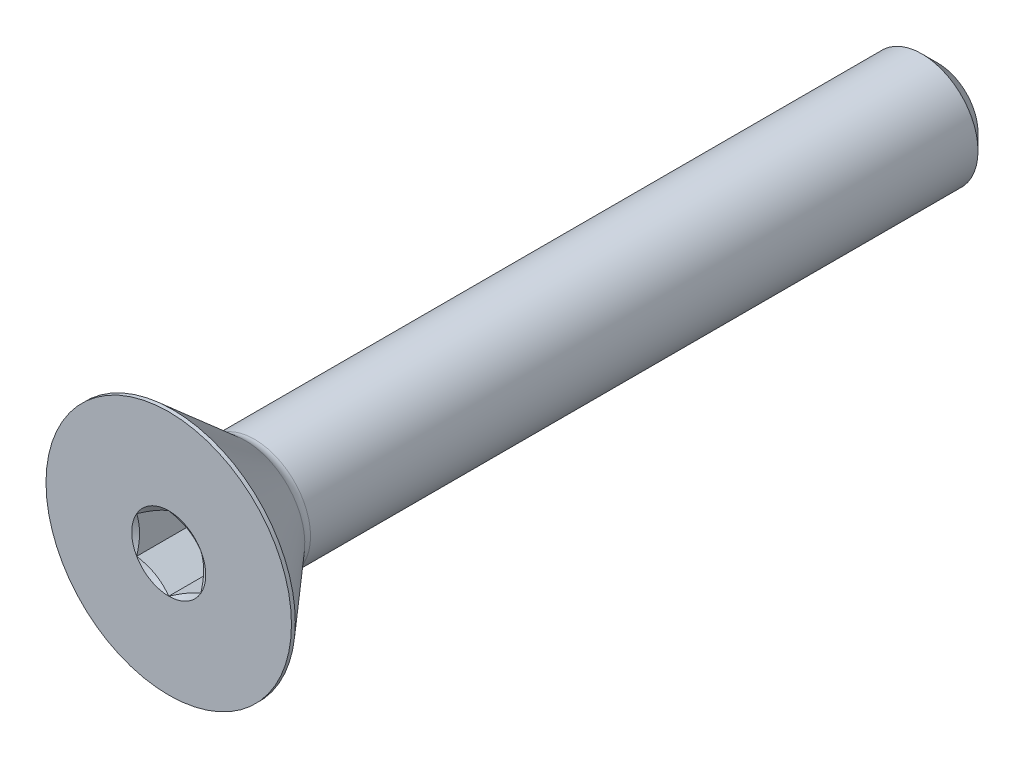
ISO-10303-21;
HEADER;
FILE_DESCRIPTION(('STEP AP214'),'2;1');
FILE_NAME('part.step','',(''),(''),'','','');
FILE_SCHEMA(('AUTOMOTIVE_DESIGN { 1 0 10303 214 1 1 1 1 }'));
ENDSEC;
DATA;
#1=APPLICATION_CONTEXT('core data for automotive mechanical design processes');
#2=APPLICATION_PROTOCOL_DEFINITION('international standard','automotive_design',2000,#1);
#3=PRODUCT_CONTEXT('',#1,'mechanical');
#4=PRODUCT('Part','Part','',(#3));
#5=PRODUCT_RELATED_PRODUCT_CATEGORY('part','',(#4));
#6=PRODUCT_DEFINITION_FORMATION('','',#4);
#7=PRODUCT_DEFINITION_CONTEXT('part definition',#1,'design');
#8=PRODUCT_DEFINITION('design','',#6,#7);
#9=PRODUCT_DEFINITION_SHAPE('','',#8);
#10=(LENGTH_UNIT() NAMED_UNIT(*) SI_UNIT(.MILLI.,.METRE.));
#11=(NAMED_UNIT(*) PLANE_ANGLE_UNIT() SI_UNIT($,.RADIAN.));
#12=(NAMED_UNIT(*) SI_UNIT($,.STERADIAN.) SOLID_ANGLE_UNIT());
#13=UNCERTAINTY_MEASURE_WITH_UNIT(LENGTH_MEASURE(1.E-05),#10,'distance_accuracy_value','');
#14=(GEOMETRIC_REPRESENTATION_CONTEXT(3) GLOBAL_UNCERTAINTY_ASSIGNED_CONTEXT((#13)) GLOBAL_UNIT_ASSIGNED_CONTEXT((#10,
#11,#12)) REPRESENTATION_CONTEXT('',''));
#15=CARTESIAN_POINT('',(0.,0.,0.));
#16=DIRECTION('',(0.,0.,1.));
#17=DIRECTION('',(1.,0.,0.));
#18=AXIS2_PLACEMENT_3D('',#15,#16,#17);
#19=CARTESIAN_POINT('',(-1.190625,0.687407664253899,-1.99136));
#20=DIRECTION('',(-1.,0.,0.));
#21=DIRECTION('',(0.,-1.,0.));
#22=AXIS2_PLACEMENT_3D('',#19,#20,#21);
#23=PLANE('',#22);
#24=CARTESIAN_POINT('',(-1.190625,-0.687407664256463,-5.03401109731775E-12));
#25=CARTESIAN_POINT('',(-1.190625,-0.626992856751789,-0.0174453082922929));
#26=CARTESIAN_POINT('',(-1.190625,-0.566056549488464,-0.0333109031601274));
#27=CARTESIAN_POINT('',(-1.190625,-0.443128863563517,-0.0610038224899523));
#28=CARTESIAN_POINT('',(-1.190625,-0.381135301425816,-0.0728213513161339));
#29=CARTESIAN_POINT('',(-1.190625,-0.257916432288905,-0.091216186921769));
#30=CARTESIAN_POINT('',(-1.190625,-0.196710078781245,-0.0979159358017033));
#31=CARTESIAN_POINT('',(-1.190625,-0.0740095259036076,-0.105912542076732));
#32=CARTESIAN_POINT('',(-1.190625,-0.0125157722107632,-0.107216022941889));
#33=CARTESIAN_POINT('',(-1.190625,0.102378709677028,-0.10449741162382));
#34=CARTESIAN_POINT('',(-1.190625,0.155796678724978,-0.101142828627492));
#35=CARTESIAN_POINT('',(-1.190625,0.262284616177316,-0.0905129194020046));
#36=CARTESIAN_POINT('',(-1.190625,0.315354216543268,-0.0832339655705969));
#37=CARTESIAN_POINT('',(-1.190625,0.422061529189285,-0.0650379898324941));
#38=CARTESIAN_POINT('',(-1.190625,0.475685743031827,-0.0540438723610452));
#39=CARTESIAN_POINT('',(-1.190625,0.582134596890679,-0.0290918736246562));
#40=CARTESIAN_POINT('',(-1.190625,0.634960599587853,-0.0151398513230711));
#41=CARTESIAN_POINT('',(-1.190625,0.687407664256464,-5.03342759882053E-12));
#42=B_SPLINE_CURVE_WITH_KNOTS('',3,(#24,#25,#26,#27,#28,#29,#30,#31,#32,#33,#34,#35,#36,#37,#38,
#39,#40,#41),.UNSPECIFIED.,.F.,.F.,(4,2,2,2,2,2,2,2,4),(0.,0.188723594372522,0.377900694183834,
0.56239624676756,0.746665279146542,0.907082289328546,1.0676478403546,1.2317739658786,
1.39557798110354),.UNSPECIFIED.);
#43=CARTESIAN_POINT('',(-1.19062500000111,-0.687407664263259,-2.51690109504208E-12));
#44=VERTEX_POINT('',#43);
#45=CARTESIAN_POINT('',(-1.19062500000866,0.687407664250182,-2.5166847221934E-12));
#46=VERTEX_POINT('',#45);
#47=EDGE_CURVE('E29',#44,#46,#42,.T.);
#48=ORIENTED_EDGE('',*,*,#47,.F.);
#49=DIRECTION('',(0.,0.,1.));
#50=VECTOR('',#49,1.);
#51=CARTESIAN_POINT('',(-1.190625,-0.687407664253899,-1.99136));
#52=LINE('',#51,#50);
#53=CARTESIAN_POINT('',(-1.190625,-0.687407664253899,-1.99136));
#54=VERTEX_POINT('',#53);
#55=EDGE_CURVE('E131',#44,#54,#52,.F.);
#56=ORIENTED_EDGE('',*,*,#55,.T.);
#57=DIRECTION('',(0.,-1.,0.));
#58=VECTOR('',#57,1.);
#59=CARTESIAN_POINT('',(-1.190625,0.687407664253899,-1.99136));
#60=LINE('',#59,#58);
#61=CARTESIAN_POINT('',(-1.190625,0.6874076642539,-1.99136));
#62=VERTEX_POINT('',#61);
#63=EDGE_CURVE('E97',#62,#54,#60,.T.);
#64=ORIENTED_EDGE('',*,*,#63,.F.);
#65=DIRECTION('',(0.,0.,1.));
#66=VECTOR('',#65,1.);
#67=CARTESIAN_POINT('',(-1.190625,0.687407664253899,-1.99136));
#68=LINE('',#67,#66);
#69=EDGE_CURVE('E96',#62,#46,#68,.T.);
#70=ORIENTED_EDGE('',*,*,#69,.T.);
#71=EDGE_LOOP('',(#48,#56,#64,#70));
#72=FACE_BOUND('',#71,.T.);
#73=ADVANCED_FACE('F25',(#72),#23,.F.);
#74=CARTESIAN_POINT('',(0.,1.3748153285078,-1.99136));
#75=DIRECTION('',(-0.5,0.866025403784439,0.));
#76=DIRECTION('',(-0.866025403784439,-0.5,0.));
#77=AXIS2_PLACEMENT_3D('',#74,#75,#76);
#78=PLANE('',#77);
#79=CARTESIAN_POINT('',(-1.19062500000222,0.687407664252618,-5.03379331456237E-12));
#80=CARTESIAN_POINT('',(-1.13830424193826,0.717615068005051,-0.017445308292975));
#81=CARTESIAN_POINT('',(-1.08553185183521,0.748083221636828,-0.0333109031614361));
#82=CARTESIAN_POINT('',(-0.979073352995295,0.809547064599574,-0.0610038224923478));
#83=CARTESIAN_POINT('',(-0.925385353312685,0.840543845668582,-0.0728213513189882));
#84=CARTESIAN_POINT('',(-0.818674682414037,0.902153280237322,-0.0912161869252817));
#85=CARTESIAN_POINT('',(-0.765668425403175,0.932756456991278,-0.0979159358054302));
#86=CARTESIAN_POINT('',(-0.659406629552295,0.994106733430356,-0.105912542080642));
#87=CARTESIAN_POINT('',(-0.606151476679997,1.02485361027691,-0.107216022945769));
#88=CARTESIAN_POINT('',(-0.506649936610504,1.08230085122082,-0.104497411627427));
#89=CARTESIAN_POINT('',(-0.460388618396622,1.10900983574467,-0.101142828630923));
#90=CARTESIAN_POINT('',(-0.368167359366739,1.16225380447058,-0.090512919404986));
#91=CARTESIAN_POINT('',(-0.322207737281372,1.18878860465342,-0.0832339655733058));
#92=CARTESIAN_POINT('',(-0.229796493760794,1.24214226097617,-0.0650379898345645));
#93=CARTESIAN_POINT('',(-0.18335656231539,1.26895436789732,-0.0540438723627428));
#94=CARTESIAN_POINT('',(-0.0911691506703446,1.32217879482648,-0.0290918736255461));
#95=CARTESIAN_POINT('',(-0.045420490354456,1.34859179617493,-0.0151398513235267));
#96=CARTESIAN_POINT('',(2.21941767620509E-12,1.37481532850908,-5.03397609308233E-12));
#97=B_SPLINE_CURVE_WITH_KNOTS('',3,(#79,#80,#81,#82,#83,#84,#85,#86,#87,#88,#89,#90,#91,#92,#93,
#94,#95,#96),.UNSPECIFIED.,.F.,.F.,(4,2,2,2,2,2,2,2,4),(0.,0.188723594373651,0.377900694186133,
0.562396246770661,0.746665279150423,0.907082289331712,1.06764784035706,1.23177396588058,
1.39557798110501),.UNSPECIFIED.);
#98=CARTESIAN_POINT('',(-7.55282814164622E-12,1.37481532851344,-2.51699768875043E-12));
#99=VERTEX_POINT('',#98);
#100=EDGE_CURVE('E105',#46,#99,#97,.T.);
#101=ORIENTED_EDGE('',*,*,#100,.F.);
#102=ORIENTED_EDGE('',*,*,#69,.F.);
#103=DIRECTION('',(-0.866025403784439,-0.5,0.));
#104=VECTOR('',#103,1.);
#105=CARTESIAN_POINT('',(0.,1.3748153285078,-1.99136));
#106=LINE('',#105,#104);
#107=CARTESIAN_POINT('',(0.,1.3748153285078,-1.99136));
#108=VERTEX_POINT('',#107);
#109=EDGE_CURVE('E291',#108,#62,#106,.T.);
#110=ORIENTED_EDGE('',*,*,#109,.F.);
#111=DIRECTION('',(0.,0.,1.));
#112=VECTOR('',#111,1.);
#113=CARTESIAN_POINT('',(0.,1.3748153285078,-1.99136));
#114=LINE('',#113,#112);
#115=EDGE_CURVE('E126',#108,#99,#114,.T.);
#116=ORIENTED_EDGE('',*,*,#115,.T.);
#117=EDGE_LOOP('',(#101,#102,#110,#116));
#118=FACE_BOUND('',#117,.T.);
#119=ADVANCED_FACE('F124',(#118),#78,.F.);
#120=CARTESIAN_POINT('',(-1.190625,-0.687407664253899,-1.99136));
#121=DIRECTION('',(-0.5,-0.866025403784439,0.));
#122=DIRECTION('',(0.866025403784439,-0.5,0.));
#123=AXIS2_PLACEMENT_3D('',#120,#121,#122);
#124=PLANE('',#123);
#125=CARTESIAN_POINT('',(2.22150647508113E-12,-1.37481532850908,-5.03404687750762E-12));
#126=CARTESIAN_POINT('',(-0.052320758061739,-1.34460792475665,-0.0174453082929752));
#127=CARTESIAN_POINT('',(-0.105093148164792,-1.31413977112487,-0.0333109031614363));
#128=CARTESIAN_POINT('',(-0.211551647004703,-1.25267592816212,-0.061003822492348));
#129=CARTESIAN_POINT('',(-0.265239646687313,-1.22167914709311,-0.0728213513189884));
#130=CARTESIAN_POINT('',(-0.371950317585961,-1.16006971252437,-0.0912161869252821));
#131=CARTESIAN_POINT('',(-0.424956574596824,-1.12946653577042,-0.0979159358054306));
#132=CARTESIAN_POINT('',(-0.531218370447703,-1.06811625933134,-0.105912542080642));
#133=CARTESIAN_POINT('',(-0.584473523320001,-1.03736938248478,-0.10721602294577));
#134=CARTESIAN_POINT('',(-0.683975063389495,-0.97992214154088,-0.104497411627427));
#135=CARTESIAN_POINT('',(-0.730236381603377,-0.953213157017029,-0.101142828630923));
#136=CARTESIAN_POINT('',(-0.822457640633261,-0.899969188291119,-0.0905129194049867));
#137=CARTESIAN_POINT('',(-0.868417262718628,-0.873434388108279,-0.0832339655733063));
#138=CARTESIAN_POINT('',(-0.960828506239207,-0.820080731785525,-0.0650379898345648));
#139=CARTESIAN_POINT('',(-1.00726843768461,-0.793268624864373,-0.054043872362743));
#140=CARTESIAN_POINT('',(-1.09945584932966,-0.740044197935211,-0.029091873625546));
#141=CARTESIAN_POINT('',(-1.14520450964555,-0.713631196586768,-0.0151398513235265));
#142=CARTESIAN_POINT('',(-1.19062500000222,-0.687407664252616,-5.03369635507482E-12));
#143=B_SPLINE_CURVE_WITH_KNOTS('',3,(#125,#126,#127,#128,#129,#130,#131,#132,#133,#134,#135,
#136,#137,#138,#139,#140,#141,#142),.UNSPECIFIED.,.F.,.F.,(4,2,2,2,2,2,2,2,4),(0.,
0.18872359437365,0.377900694186133,0.56239624677066,0.746665279150422,0.907082289331712,
1.06764784035706,1.23177396588058,1.39557798110501),.UNSPECIFIED.);
#144=CARTESIAN_POINT('',(7.55153101609058E-12,-1.37481532851344,-2.5171713488915E-12));
#145=VERTEX_POINT('',#144);
#146=EDGE_CURVE('E79',#145,#44,#143,.T.);
#147=ORIENTED_EDGE('',*,*,#146,.F.);
#148=DIRECTION('',(0.,0.,1.));
#149=VECTOR('',#148,1.);
#150=CARTESIAN_POINT('',(0.,-1.3748153285078,-1.99136));
#151=LINE('',#150,#149);
#152=CARTESIAN_POINT('',(0.,-1.3748153285078,-1.99136));
#153=VERTEX_POINT('',#152);
#154=EDGE_CURVE('E262',#145,#153,#151,.F.);
#155=ORIENTED_EDGE('',*,*,#154,.T.);
#156=DIRECTION('',(0.866025403784439,-0.5,0.));
#157=VECTOR('',#156,1.);
#158=CARTESIAN_POINT('',(-1.190625,-0.687407664253899,-1.99136));
#159=LINE('',#158,#157);
#160=EDGE_CURVE('E286',#54,#153,#159,.T.);
#161=ORIENTED_EDGE('',*,*,#160,.F.);
#162=ORIENTED_EDGE('',*,*,#55,.F.);
#163=EDGE_LOOP('',(#147,#155,#161,#162));
#164=FACE_BOUND('',#163,.T.);
#165=ADVANCED_FACE('F149',(#164),#124,.F.);
#166=CARTESIAN_POINT('',(0.,1.3748153285078,-1.99136));
#167=DIRECTION('',(0.,0.,1.));
#168=DIRECTION('',(1.,0.,0.));
#169=AXIS2_PLACEMENT_3D('',#166,#167,#168);
#170=PLANE('',#169);
#171=DIRECTION('',(0.866025403784439,0.5,0.));
#172=VECTOR('',#171,1.);
#173=CARTESIAN_POINT('',(0.,-1.3748153285078,-1.99136));
#174=LINE('',#173,#172);
#175=CARTESIAN_POINT('',(1.190625,-0.687407664253899,-1.99136));
#176=VERTEX_POINT('',#175);
#177=EDGE_CURVE('E174',#153,#176,#174,.T.);
#178=ORIENTED_EDGE('',*,*,#177,.T.);
#179=DIRECTION('',(0.,1.,0.));
#180=VECTOR('',#179,1.);
#181=CARTESIAN_POINT('',(1.190625,-0.687407664253898,-1.99136));
#182=LINE('',#181,#180);
#183=CARTESIAN_POINT('',(1.190625,0.687407664253898,-1.99136));
#184=VERTEX_POINT('',#183);
#185=EDGE_CURVE('E259',#176,#184,#182,.T.);
#186=ORIENTED_EDGE('',*,*,#185,.T.);
#187=DIRECTION('',(-0.866025403784439,0.499999999999999,0.));
#188=VECTOR('',#187,1.);
#189=CARTESIAN_POINT('',(1.190625,0.687407664253898,-1.99136));
#190=LINE('',#189,#188);
#191=EDGE_CURVE('E280',#184,#108,#190,.T.);
#192=ORIENTED_EDGE('',*,*,#191,.T.);
#193=ORIENTED_EDGE('',*,*,#109,.T.);
#194=ORIENTED_EDGE('',*,*,#63,.T.);
#195=ORIENTED_EDGE('',*,*,#160,.T.);
#196=EDGE_LOOP('',(#178,#186,#192,#193,#194,#195));
#197=FACE_BOUND('',#196,.T.);
#198=ADVANCED_FACE('F153',(#197),#170,.T.);
#199=CARTESIAN_POINT('',(1.190625,0.687407664253898,-1.99136));
#200=DIRECTION('',(0.499999999999999,0.866025403784439,0.));
#201=DIRECTION('',(-0.866025403784439,0.499999999999999,0.));
#202=AXIS2_PLACEMENT_3D('',#199,#200,#201);
#203=PLANE('',#202);
#204=CARTESIAN_POINT('',(-2.22241017051823E-12,1.37481532850908,-5.03424382783473E-12));
#205=CARTESIAN_POINT('',(0.0523207580617382,1.34460792475665,-0.0174453082929756));
#206=CARTESIAN_POINT('',(0.105093148164792,1.31413977112487,-0.0333109031614368));
#207=CARTESIAN_POINT('',(0.211551647004703,1.25267592816212,-0.0610038224923485));
#208=CARTESIAN_POINT('',(0.265239646687313,1.22167914709311,-0.0728213513189889));
#209=CARTESIAN_POINT('',(0.371950317585961,1.16006971252437,-0.0912161869252825));
#210=CARTESIAN_POINT('',(0.424956574596823,1.12946653577042,-0.097915935805431));
#211=CARTESIAN_POINT('',(0.531218370447702,1.06811625933134,-0.105912542080643));
#212=CARTESIAN_POINT('',(0.58447352332,1.03736938248478,-0.10721602294577));
#213=CARTESIAN_POINT('',(0.683975063389532,0.979922141540858,-0.104497411627427));
#214=CARTESIAN_POINT('',(0.730236381603451,0.953213157016985,-0.101142828630918));
#215=CARTESIAN_POINT('',(0.822457640633409,0.899969188291033,-0.0905129194049667));
#216=CARTESIAN_POINT('',(0.868417262718813,0.873434388108171,-0.0832339655732759));
#217=CARTESIAN_POINT('',(0.960828506239466,0.820080731785374,-0.0650379898345082));
#218=CARTESIAN_POINT('',(1.00726843768491,0.793268624864201,-0.0540438723626703));
#219=CARTESIAN_POINT('',(1.09945584933003,0.740044197934996,-0.029091873625438));
#220=CARTESIAN_POINT('',(1.14520450964595,0.713631196586532,-0.0151398513233992));
#221=CARTESIAN_POINT('',(1.19062500000266,0.68740766425236,-4.88618793780333E-12));
#222=B_SPLINE_CURVE_WITH_KNOTS('',3,(#204,#205,#206,#207,#208,#209,#210,#211,#212,#213,#214,
#215,#216,#217,#218,#219,#220,#221),.UNSPECIFIED.,.F.,.F.,(4,2,2,2,2,2,2,2,4),(0.,
0.188723594373651,0.377900694186134,0.562396246770661,0.746665279150422,0.907082289331842,
1.06764784035732,1.23177396588098,1.39557798110555),.UNSPECIFIED.);
#223=CARTESIAN_POINT('',(1.19062500000433,0.687407664256399,-2.88718183032092E-12));
#224=VERTEX_POINT('',#223);
#225=EDGE_CURVE('E166',#99,#224,#222,.T.);
#226=ORIENTED_EDGE('',*,*,#225,.F.);
#227=ORIENTED_EDGE('',*,*,#115,.F.);
#228=ORIENTED_EDGE('',*,*,#191,.F.);
#229=DIRECTION('',(0.,0.,1.));
#230=VECTOR('',#229,1.);
#231=CARTESIAN_POINT('',(1.190625,0.687407664253898,-1.99136));
#232=LINE('',#231,#230);
#233=EDGE_CURVE('E253',#184,#224,#232,.T.);
#234=ORIENTED_EDGE('',*,*,#233,.T.);
#235=EDGE_LOOP('',(#226,#227,#228,#234));
#236=FACE_BOUND('',#235,.T.);
#237=ADVANCED_FACE('F157',(#236),#203,.F.);
#238=CARTESIAN_POINT('',(0.,-1.3748153285078,-1.99136));
#239=DIRECTION('',(0.5,-0.866025403784439,0.));
#240=DIRECTION('',(0.866025403784439,0.5,0.));
#241=AXIS2_PLACEMENT_3D('',#238,#239,#240);
#242=PLANE('',#241);
#243=CARTESIAN_POINT('',(1.19062500000266,-0.68740766425236,-4.88590636443419E-12));
#244=CARTESIAN_POINT('',(1.1383042419387,-0.717615068004797,-0.0174453082928392));
#245=CARTESIAN_POINT('',(1.08553185183564,-0.748083221636579,-0.0333109031613132));
#246=CARTESIAN_POINT('',(0.97907335299571,-0.809547064599334,-0.0610038224922516));
#247=CARTESIAN_POINT('',(0.925385353313092,-0.840543845668346,-0.0728213513189059));
#248=CARTESIAN_POINT('',(0.818674682414427,-0.902153280237096,-0.0912161869252271));
#249=CARTESIAN_POINT('',(0.765668425403557,-0.932756456991056,-0.0979159358053894));
#250=CARTESIAN_POINT('',(0.65940662955266,-0.994106733430144,-0.105912542080627));
#251=CARTESIAN_POINT('',(0.606151476680353,-1.02485361027671,-0.107216022945767));
#252=CARTESIAN_POINT('',(0.506649936610822,-1.08230085122063,-0.104497411627446));
#253=CARTESIAN_POINT('',(0.460388618396912,-1.1090098357445,-0.101142828630949));
#254=CARTESIAN_POINT('',(0.368167359366971,-1.16225380447044,-0.0905129194050209));
#255=CARTESIAN_POINT('',(0.322207737281575,-1.1887886046533,-0.083233965573342));
#256=CARTESIAN_POINT('',(0.229796493760939,-1.24214226097609,-0.0650379898345983));
#257=CARTESIAN_POINT('',(0.183356562315505,-1.26895436789725,-0.0540438723627726));
#258=CARTESIAN_POINT('',(0.0911691506704009,-1.32217879482645,-0.0290918736255639));
#259=CARTESIAN_POINT('',(0.0454204903544834,-1.34859179617491,-0.0151398513235365));
#260=CARTESIAN_POINT('',(-2.22049957903843E-12,-1.37481532850908,-5.03444676112562E-12));
#261=B_SPLINE_CURVE_WITH_KNOTS('',3,(#243,#244,#245,#246,#247,#248,#249,#250,#251,#252,#253,
#254,#255,#256,#257,#258,#259,#260),.UNSPECIFIED.,.F.,.F.,(4,2,2,2,2,2,2,2,4),(0.,
0.188723594373685,0.377900694186203,0.562396246770763,0.746665279150557,0.907082289331943,
1.06764784035739,1.23177396588101,1.39557798110554),.UNSPECIFIED.);
#262=CARTESIAN_POINT('',(1.19062500000133,-0.68740766426313,-2.442926281805E-12));
#263=VERTEX_POINT('',#262);
#264=EDGE_CURVE('E175',#263,#145,#261,.T.);
#265=ORIENTED_EDGE('',*,*,#264,.F.);
#266=DIRECTION('',(0.,0.,1.));
#267=VECTOR('',#266,1.);
#268=CARTESIAN_POINT('',(1.190625,-0.687407664253899,-1.99136));
#269=LINE('',#268,#267);
#270=EDGE_CURVE('E200',#263,#176,#269,.F.);
#271=ORIENTED_EDGE('',*,*,#270,.T.);
#272=ORIENTED_EDGE('',*,*,#177,.F.);
#273=ORIENTED_EDGE('',*,*,#154,.F.);
#274=EDGE_LOOP('',(#265,#271,#272,#273));
#275=FACE_BOUND('',#274,.T.);
#276=ADVANCED_FACE('F162',(#275),#242,.F.);
#277=CARTESIAN_POINT('',(1.190625,-0.687407664253898,-1.99136));
#278=DIRECTION('',(1.,0.,0.));
#279=DIRECTION('',(0.,1.,0.));
#280=AXIS2_PLACEMENT_3D('',#277,#278,#279);
#281=PLANE('',#280);
#282=CARTESIAN_POINT('',(1.190625,-0.687407664256976,-4.88565616382747E-12));
#283=CARTESIAN_POINT('',(1.190625,-0.630978311343428,-0.0162914570880793));
#284=CARTESIAN_POINT('',(1.190625,-0.574102552152897,-0.0312067456416494));
#285=CARTESIAN_POINT('',(1.190625,-0.459427126447954,-0.0575676674813178));
#286=CARTESIAN_POINT('',(1.190625,-0.40162569163526,-0.0690055376257263));
#287=CARTESIAN_POINT('',(1.190625,-0.286671405819619,-0.0873990175345061));
#288=CARTESIAN_POINT('',(1.190625,-0.229534739462988,-0.0944526936339326));
#289=CARTESIAN_POINT('',(1.190625,-0.114931764770312,-0.103921835423822));
#290=CARTESIAN_POINT('',(1.190625,-0.0574658823850728,-0.10634233572728));
#291=CARTESIAN_POINT('',(1.190625,0.0574658823853776,-0.106342335727271));
#292=CARTESIAN_POINT('',(1.190625,0.114931764770589,-0.103921835423806));
#293=CARTESIAN_POINT('',(1.190625,0.229534739463211,-0.0944526936339076));
#294=CARTESIAN_POINT('',(1.190625,0.286671405819814,-0.0873990175344792));
#295=CARTESIAN_POINT('',(1.190625,0.401625691635399,-0.0690055376257));
#296=CARTESIAN_POINT('',(1.190625,0.459427126448064,-0.0575676674812944));
#297=CARTESIAN_POINT('',(1.190625,0.574102552152951,-0.0312067456416353));
#298=CARTESIAN_POINT('',(1.190625,0.630978311343455,-0.0162914570880717));
#299=CARTESIAN_POINT('',(1.190625,0.687407664256976,-4.88590265261265E-12));
#300=B_SPLINE_CURVE_WITH_KNOTS('',3,(#282,#283,#284,#285,#286,#287,#288,#289,#290,#291,#292,
#293,#294,#295,#296,#297,#298,#299),.UNSPECIFIED.,.F.,.F.,(4,2,2,2,2,2,2,2,4),(0.,
0.176256193505853,0.352903027653007,0.525441183347368,0.697791744805782,0.870142306264115,
1.04268046195839,1.21932729610546,1.39558348961123),.UNSPECIFIED.);
#301=EDGE_CURVE('E54',#263,#224,#300,.T.);
#302=ORIENTED_EDGE('',*,*,#301,.T.);
#303=ORIENTED_EDGE('',*,*,#233,.F.);
#304=ORIENTED_EDGE('',*,*,#185,.F.);
#305=ORIENTED_EDGE('',*,*,#270,.F.);
#306=EDGE_LOOP('',(#302,#303,#304,#305));
#307=FACE_BOUND('',#306,.T.);
#308=ADVANCED_FACE('F202',(#307),#281,.F.);
#309=CARTESIAN_POINT('',(0.,0.,0.));
#310=DIRECTION('',(0.,0.,1.));
#311=DIRECTION('',(1.,0.,0.));
#312=AXIS2_PLACEMENT_3D('',#309,#310,#311);
#313=CONICAL_SURFACE('',#312,1.3748153285178,1.04719755128582);
#314=ORIENTED_EDGE('',*,*,#264,.T.);
#315=CARTESIAN_POINT('',(0.,0.,0.));
#316=DIRECTION('',(0.,0.,1.));
#317=DIRECTION('',(1.,0.,0.));
#318=AXIS2_PLACEMENT_3D('',#315,#316,#317);
#319=CIRCLE('',#318,1.3748153285178);
#320=EDGE_CURVE('E199',#263,#145,#319,.F.);
#321=ORIENTED_EDGE('',*,*,#320,.F.);
#322=EDGE_LOOP('',(#314,#321));
#323=FACE_BOUND('',#322,.T.);
#324=ADVANCED_FACE('F205',(#323),#313,.F.);
#325=CARTESIAN_POINT('',(0.,0.,0.));
#326=DIRECTION('',(0.,0.,1.));
#327=DIRECTION('',(1.,0.,0.));
#328=AXIS2_PLACEMENT_3D('',#325,#326,#327);
#329=CONICAL_SURFACE('',#328,1.3748153285178,1.04719755128582);
#330=ORIENTED_EDGE('',*,*,#146,.T.);
#331=CARTESIAN_POINT('',(0.,0.,0.));
#332=DIRECTION('',(0.,0.,1.));
#333=DIRECTION('',(1.,0.,0.));
#334=AXIS2_PLACEMENT_3D('',#331,#332,#333);
#335=CIRCLE('',#334,1.3748153285178);
#336=EDGE_CURVE('E115',#145,#44,#335,.F.);
#337=ORIENTED_EDGE('',*,*,#336,.F.);
#338=EDGE_LOOP('',(#330,#337));
#339=FACE_BOUND('',#338,.T.);
#340=ADVANCED_FACE('F208',(#339),#329,.F.);
#341=CARTESIAN_POINT('',(0.,0.,0.));
#342=DIRECTION('',(0.,0.,1.));
#343=DIRECTION('',(1.,0.,0.));
#344=AXIS2_PLACEMENT_3D('',#341,#342,#343);
#345=CONICAL_SURFACE('',#344,1.3748153285178,1.0471975513014);
#346=ORIENTED_EDGE('',*,*,#47,.T.);
#347=CARTESIAN_POINT('',(0.,0.,0.));
#348=DIRECTION('',(0.,0.,1.));
#349=DIRECTION('',(1.,0.,0.));
#350=AXIS2_PLACEMENT_3D('',#347,#348,#349);
#351=CIRCLE('',#350,1.3748153285178);
#352=EDGE_CURVE('E91',#44,#46,#351,.F.);
#353=ORIENTED_EDGE('',*,*,#352,.F.);
#354=EDGE_LOOP('',(#346,#353));
#355=FACE_BOUND('',#354,.T.);
#356=ADVANCED_FACE('F89',(#355),#345,.F.);
#357=CARTESIAN_POINT('',(0.,0.,0.));
#358=DIRECTION('',(0.,0.,1.));
#359=DIRECTION('',(1.,0.,0.));
#360=AXIS2_PLACEMENT_3D('',#357,#358,#359);
#361=CONICAL_SURFACE('',#360,1.3748153285178,1.04719755128582);
#362=ORIENTED_EDGE('',*,*,#100,.T.);
#363=CARTESIAN_POINT('',(0.,0.,0.));
#364=DIRECTION('',(0.,0.,1.));
#365=DIRECTION('',(1.,0.,0.));
#366=AXIS2_PLACEMENT_3D('',#363,#364,#365);
#367=CIRCLE('',#366,1.3748153285178);
#368=EDGE_CURVE('E112',#46,#99,#367,.F.);
#369=ORIENTED_EDGE('',*,*,#368,.F.);
#370=EDGE_LOOP('',(#362,#369));
#371=FACE_BOUND('',#370,.T.);
#372=ADVANCED_FACE('F119',(#371),#361,.F.);
#373=CARTESIAN_POINT('',(0.,0.,0.));
#374=DIRECTION('',(0.,0.,1.));
#375=DIRECTION('',(1.,0.,0.));
#376=AXIS2_PLACEMENT_3D('',#373,#374,#375);
#377=CONICAL_SURFACE('',#376,1.3748153285178,1.04719755128582);
#378=ORIENTED_EDGE('',*,*,#225,.T.);
#379=CARTESIAN_POINT('',(0.,0.,0.));
#380=DIRECTION('',(0.,0.,1.));
#381=DIRECTION('',(1.,0.,0.));
#382=AXIS2_PLACEMENT_3D('',#379,#380,#381);
#383=CIRCLE('',#382,1.3748153285178);
#384=EDGE_CURVE('E122',#99,#224,#383,.F.);
#385=ORIENTED_EDGE('',*,*,#384,.F.);
#386=EDGE_LOOP('',(#378,#385));
#387=FACE_BOUND('',#386,.T.);
#388=ADVANCED_FACE('F182',(#387),#377,.F.);
#389=CARTESIAN_POINT('',(0.,0.,0.));
#390=DIRECTION('',(0.,0.,1.));
#391=DIRECTION('',(1.,0.,0.));
#392=AXIS2_PLACEMENT_3D('',#389,#390,#391);
#393=CONICAL_SURFACE('',#392,1.3748153285178,1.04719755129677);
#394=ORIENTED_EDGE('',*,*,#301,.F.);
#395=CARTESIAN_POINT('',(0.,0.,0.));
#396=DIRECTION('',(0.,0.,1.));
#397=DIRECTION('',(1.,0.,0.));
#398=AXIS2_PLACEMENT_3D('',#395,#396,#397);
#399=CIRCLE('',#398,1.3748153285178);
#400=EDGE_CURVE('E315',#224,#263,#399,.F.);
#401=ORIENTED_EDGE('',*,*,#400,.F.);
#402=EDGE_LOOP('',(#394,#401));
#403=FACE_BOUND('',#402,.T.);
#404=ADVANCED_FACE('F186',(#403),#393,.F.);
#405=CARTESIAN_POINT('',(0.,-2.0828,0.));
#406=DIRECTION('',(0.,0.,1.));
#407=DIRECTION('',(0.,-1.,0.));
#408=AXIS2_PLACEMENT_3D('',#405,#406,#407);
#409=PLANE('',#408);
#410=CARTESIAN_POINT('',(0.,0.,0.));
#411=DIRECTION('',(0.,0.,1.));
#412=DIRECTION('',(0.,-1.,0.));
#413=AXIS2_PLACEMENT_3D('',#410,#411,#412);
#414=CIRCLE('',#413,4.5593);
#415=CARTESIAN_POINT('',(0.,-4.5593,0.));
#416=VERTEX_POINT('',#415);
#417=EDGE_CURVE('E249',#416,#416,#414,.F.);
#418=ORIENTED_EDGE('',*,*,#417,.F.);
#419=EDGE_LOOP('',(#418));
#420=FACE_BOUND('',#419,.T.);
#421=ORIENTED_EDGE('',*,*,#384,.T.);
#422=ORIENTED_EDGE('',*,*,#400,.T.);
#423=ORIENTED_EDGE('',*,*,#320,.T.);
#424=ORIENTED_EDGE('',*,*,#336,.T.);
#425=ORIENTED_EDGE('',*,*,#352,.T.);
#426=ORIENTED_EDGE('',*,*,#368,.T.);
#427=EDGE_LOOP('',(#421,#422,#423,#424,#425,#426));
#428=FACE_BOUND('',#427,.T.);
#429=ADVANCED_FACE('F111',(#420,#428),#409,.T.);
#430=CARTESIAN_POINT('',(0.,0.,0.));
#431=DIRECTION('',(0.,0.,1.));
#432=DIRECTION('',(0.,-1.,0.));
#433=AXIS2_PLACEMENT_3D('',#430,#431,#432);
#434=CYLINDRICAL_SURFACE('',#433,4.5593);
#435=ORIENTED_EDGE('',*,*,#417,.T.);
#436=EDGE_LOOP('',(#435));
#437=FACE_BOUND('',#436,.T.);
#438=CARTESIAN_POINT('',(0.,0.,-0.142240000002404));
#439=DIRECTION('',(0.,0.,1.));
#440=DIRECTION('',(0.,-1.,0.));
#441=AXIS2_PLACEMENT_3D('',#438,#439,#440);
#442=CIRCLE('',#441,4.55929999998261);
#443=CARTESIAN_POINT('',(0.,-4.55929999998261,-0.142240000002403));
#444=VERTEX_POINT('',#443);
#445=EDGE_CURVE('E245',#444,#444,#442,.F.);
#446=ORIENTED_EDGE('',*,*,#445,.F.);
#447=EDGE_LOOP('',(#446));
#448=FACE_BOUND('',#447,.T.);
#449=ADVANCED_FACE('F399',(#437,#448),#434,.T.);
#450=CARTESIAN_POINT('',(0.,0.,-0.142240000116091));
#451=DIRECTION('',(0.,0.,1.));
#452=DIRECTION('',(0.,-1.,0.));
#453=AXIS2_PLACEMENT_3D('',#450,#451,#452);
#454=CONICAL_SURFACE('',#453,4.55929999992577,0.715584993323416);
#455=ORIENTED_EDGE('',*,*,#445,.T.);
#456=EDGE_LOOP('',(#455));
#457=FACE_BOUND('',#456,.T.);
#458=CARTESIAN_POINT('',(0.,0.,-2.8448));
#459=DIRECTION('',(0.,0.,1.));
#460=DIRECTION('',(0.,-1.,0.));
#461=AXIS2_PLACEMENT_3D('',#458,#459,#460);
#462=CIRCLE('',#461,2.21000043384737);
#463=CARTESIAN_POINT('',(0.,-2.21000043384737,-2.8448));
#464=VERTEX_POINT('',#463);
#465=EDGE_CURVE('E240',#464,#464,#462,.T.);
#466=ORIENTED_EDGE('',*,*,#465,.T.);
#467=EDGE_LOOP('',(#466));
#468=FACE_BOUND('',#467,.T.);
#469=ADVANCED_FACE('F408',(#457,#468),#454,.T.);
#470=CARTESIAN_POINT('',(0.,-2.0828,-28.575));
#471=DIRECTION('',(0.,0.,-1.));
#472=DIRECTION('',(0.,1.,0.));
#473=AXIS2_PLACEMENT_3D('',#470,#471,#472);
#474=PLANE('',#473);
#475=CARTESIAN_POINT('',(0.,0.,-28.5749999999894));
#476=DIRECTION('',(0.,0.,1.));
#477=DIRECTION('',(1.,0.,0.));
#478=AXIS2_PLACEMENT_3D('',#475,#476,#477);
#479=CIRCLE('',#478,1.48748750001459);
#480=CARTESIAN_POINT('',(1.4874875000146,0.,-28.5749999999894));
#481=VERTEX_POINT('',#480);
#482=EDGE_CURVE('E244',#481,#481,#479,.T.);
#483=ORIENTED_EDGE('',*,*,#482,.F.);
#484=EDGE_LOOP('',(#483));
#485=FACE_BOUND('',#484,.T.);
#486=ADVANCED_FACE('F234',(#485),#474,.T.);
#487=CARTESIAN_POINT('',(0.,0.,-3.18501301440498));
#488=DIRECTION('',(0.,0.,1.));
#489=DIRECTION('',(0.,-1.,0.));
#490=AXIS2_PLACEMENT_3D('',#487,#488,#489);
#491=TOROIDAL_SURFACE('',#490,2.60137073734429,0.518570737344285);
#492=ORIENTED_EDGE('',*,*,#465,.F.);
#493=EDGE_LOOP('',(#492));
#494=FACE_BOUND('',#493,.T.);
#495=CARTESIAN_POINT('',(0.,0.,-3.18501301440498));
#496=DIRECTION('',(0.,0.,-1.));
#497=DIRECTION('',(0.,1.,0.));
#498=AXIS2_PLACEMENT_3D('',#495,#496,#497);
#499=CIRCLE('',#498,2.0828);
#500=CARTESIAN_POINT('',(0.,2.0828,-3.18501301440498));
#501=VERTEX_POINT('',#500);
#502=EDGE_CURVE('E41',#501,#501,#499,.T.);
#503=ORIENTED_EDGE('',*,*,#502,.F.);
#504=EDGE_LOOP('',(#503));
#505=FACE_BOUND('',#504,.T.);
#506=ADVANCED_FACE('F226',(#494,#505),#491,.F.);
#507=CARTESIAN_POINT('',(0.,0.,-27.9796875000784));
#508=DIRECTION('',(0.,0.,1.));
#509=DIRECTION('',(1.,0.,0.));
#510=AXIS2_PLACEMENT_3D('',#507,#508,#509);
#511=CONICAL_SURFACE('',#510,2.08279999992556,0.785398163397448);
#512=CARTESIAN_POINT('',(0.,0.,-27.9796875));
#513=DIRECTION('',(0.,0.,-1.));
#514=DIRECTION('',(0.,1.,0.));
#515=AXIS2_PLACEMENT_3D('',#512,#513,#514);
#516=CIRCLE('',#515,2.0828);
#517=CARTESIAN_POINT('',(0.,2.0828,-27.9796875));
#518=VERTEX_POINT('',#517);
#519=EDGE_CURVE('E13',#518,#518,#516,.F.);
#520=ORIENTED_EDGE('',*,*,#519,.F.);
#521=EDGE_LOOP('',(#520));
#522=FACE_BOUND('',#521,.T.);
#523=ORIENTED_EDGE('',*,*,#482,.T.);
#524=EDGE_LOOP('',(#523));
#525=FACE_BOUND('',#524,.T.);
#526=ADVANCED_FACE('F220',(#522,#525),#511,.T.);
#527=CARTESIAN_POINT('',(0.,0.,-28.575));
#528=DIRECTION('',(0.,0.,-1.));
#529=DIRECTION('',(0.,1.,0.));
#530=AXIS2_PLACEMENT_3D('',#527,#528,#529);
#531=CYLINDRICAL_SURFACE('',#530,2.0828);
#532=ORIENTED_EDGE('',*,*,#519,.T.);
#533=EDGE_LOOP('',(#532));
#534=FACE_BOUND('',#533,.T.);
#535=ORIENTED_EDGE('',*,*,#502,.T.);
#536=EDGE_LOOP('',(#535));
#537=FACE_BOUND('',#536,.T.);
#538=ADVANCED_FACE('F218',(#534,#537),#531,.T.);
#539=CLOSED_SHELL('',(#73,#119,#165,#198,#237,#276,#308,#324,#340,#356,#372,#388,#404,#429,#449,
#469,#486,#506,#526,#538));
#540=MANIFOLD_SOLID_BREP('B1',#539);
#541=ADVANCED_BREP_SHAPE_REPRESENTATION('',(#18,#540),#14);
#542=SHAPE_DEFINITION_REPRESENTATION(#9,#541);
ENDSEC;
END-ISO-10303-21;
